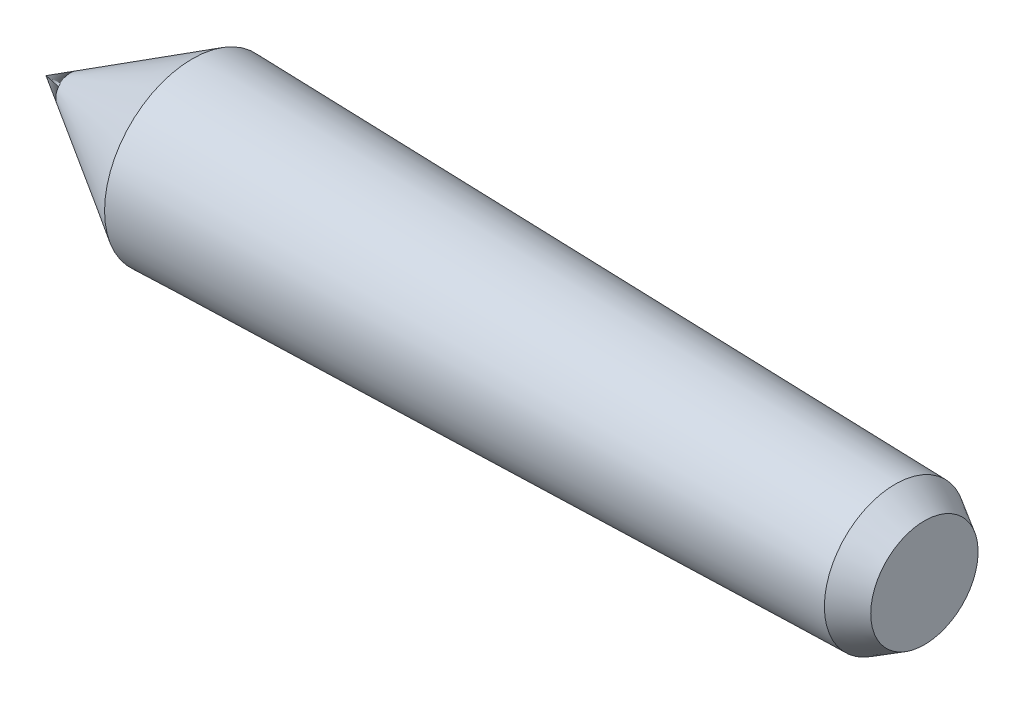
ISO-10303-21;
HEADER;
FILE_DESCRIPTION(('STEP AP214'),'2;1');
FILE_NAME('part.step','',(''),(''),'','','');
FILE_SCHEMA(('AUTOMOTIVE_DESIGN { 1 0 10303 214 1 1 1 1 }'));
ENDSEC;
DATA;
#1=APPLICATION_CONTEXT('core data for automotive mechanical design processes');
#2=APPLICATION_PROTOCOL_DEFINITION('international standard','automotive_design',2000,#1);
#3=PRODUCT_CONTEXT('',#1,'mechanical');
#4=PRODUCT('Part','Part','',(#3));
#5=PRODUCT_RELATED_PRODUCT_CATEGORY('part','',(#4));
#6=PRODUCT_DEFINITION_FORMATION('','',#4);
#7=PRODUCT_DEFINITION_CONTEXT('part definition',#1,'design');
#8=PRODUCT_DEFINITION('design','',#6,#7);
#9=PRODUCT_DEFINITION_SHAPE('','',#8);
#10=(LENGTH_UNIT() NAMED_UNIT(*) SI_UNIT(.MILLI.,.METRE.));
#11=(NAMED_UNIT(*) PLANE_ANGLE_UNIT() SI_UNIT($,.RADIAN.));
#12=(NAMED_UNIT(*) SI_UNIT($,.STERADIAN.) SOLID_ANGLE_UNIT());
#13=UNCERTAINTY_MEASURE_WITH_UNIT(LENGTH_MEASURE(1.E-05),#10,'distance_accuracy_value','');
#14=(GEOMETRIC_REPRESENTATION_CONTEXT(3) GLOBAL_UNCERTAINTY_ASSIGNED_CONTEXT((#13)) GLOBAL_UNIT_ASSIGNED_CONTEXT((#10,
#11,#12)) REPRESENTATION_CONTEXT('',''));
#15=CARTESIAN_POINT('',(0.,0.,0.));
#16=DIRECTION('',(0.,0.,1.));
#17=DIRECTION('',(1.,0.,0.));
#18=AXIS2_PLACEMENT_3D('',#15,#16,#17);
#19=CARTESIAN_POINT('',(15.,0.,0.));
#20=DIRECTION('',(1.,0.,0.));
#21=DIRECTION('',(0.,0.,-1.));
#22=AXIS2_PLACEMENT_3D('',#19,#20,#21);
#23=CONICAL_SURFACE('',#22,9.,0.540419500270584);
#24=CARTESIAN_POINT('',(0.,0.,0.));
#25=VERTEX_POINT('',#24);
#26=VERTEX_LOOP('',#25);
#27=FACE_BOUND('',#26,.T.);
#28=CARTESIAN_POINT('',(15.,0.,0.));
#29=DIRECTION('',(-1.,0.,0.));
#30=DIRECTION('',(0.,0.,1.));
#31=AXIS2_PLACEMENT_3D('',#28,#29,#30);
#32=CIRCLE('',#31,9.);
#33=CARTESIAN_POINT('',(15.,0.,9.));
#34=VERTEX_POINT('',#33);
#35=EDGE_CURVE('E11',#34,#34,#32,.T.);
#36=ORIENTED_EDGE('',*,*,#35,.T.);
#37=EDGE_LOOP('',(#36));
#38=FACE_BOUND('',#37,.T.);
#39=ADVANCED_FACE('F39',(#27,#38),#23,.T.);
#40=CARTESIAN_POINT('',(87.,0.,0.));
#41=DIRECTION('',(-1.,0.,0.));
#42=DIRECTION('',(0.,0.,1.));
#43=AXIS2_PLACEMENT_3D('',#40,#41,#42);
#44=CONICAL_SURFACE('',#43,7.25,0.0243007710011051);
#45=ORIENTED_EDGE('',*,*,#35,.F.);
#46=EDGE_LOOP('',(#45));
#47=FACE_BOUND('',#46,.T.);
#48=CARTESIAN_POINT('',(87.,0.,0.));
#49=DIRECTION('',(-1.,0.,0.));
#50=DIRECTION('',(0.,0.,1.));
#51=AXIS2_PLACEMENT_3D('',#48,#49,#50);
#52=CIRCLE('',#51,7.25);
#53=CARTESIAN_POINT('',(87.,0.,7.25));
#54=VERTEX_POINT('',#53);
#55=EDGE_CURVE('E46',#54,#54,#52,.T.);
#56=ORIENTED_EDGE('',*,*,#55,.T.);
#57=EDGE_LOOP('',(#56));
#58=FACE_BOUND('',#57,.T.);
#59=ADVANCED_FACE('F51',(#47,#58),#44,.T.);
#60=CARTESIAN_POINT('',(90.,0.,0.));
#61=DIRECTION('',(-1.,0.,0.));
#62=DIRECTION('',(0.,0.,1.));
#63=AXIS2_PLACEMENT_3D('',#60,#61,#62);
#64=CONICAL_SURFACE('',#63,5.5,0.528074448426359);
#65=ORIENTED_EDGE('',*,*,#55,.F.);
#66=EDGE_LOOP('',(#65));
#67=FACE_BOUND('',#66,.T.);
#68=CARTESIAN_POINT('',(90.,0.,0.));
#69=DIRECTION('',(-1.,0.,0.));
#70=DIRECTION('',(0.,0.,1.));
#71=AXIS2_PLACEMENT_3D('',#68,#69,#70);
#72=CIRCLE('',#71,5.5);
#73=CARTESIAN_POINT('',(90.,0.,5.5));
#74=VERTEX_POINT('',#73);
#75=EDGE_CURVE('E61',#74,#74,#72,.T.);
#76=ORIENTED_EDGE('',*,*,#75,.T.);
#77=EDGE_LOOP('',(#76));
#78=FACE_BOUND('',#77,.T.);
#79=ADVANCED_FACE('F56',(#67,#78),#64,.T.);
#80=CARTESIAN_POINT('',(90.,0.,0.));
#81=DIRECTION('',(-1.,0.,0.));
#82=DIRECTION('',(0.,0.,1.));
#83=AXIS2_PLACEMENT_3D('',#80,#81,#82);
#84=PLANE('',#83);
#85=ORIENTED_EDGE('',*,*,#75,.F.);
#86=EDGE_LOOP('',(#85));
#87=FACE_BOUND('',#86,.T.);
#88=ADVANCED_FACE('F68',(#87),#84,.F.);
#89=CLOSED_SHELL('',(#39,#59,#79,#88));
#90=MANIFOLD_SOLID_BREP('B2',#89);
#91=ADVANCED_BREP_SHAPE_REPRESENTATION('',(#18,#90),#14);
#92=SHAPE_DEFINITION_REPRESENTATION(#9,#91);
ENDSEC;
END-ISO-10303-21;
